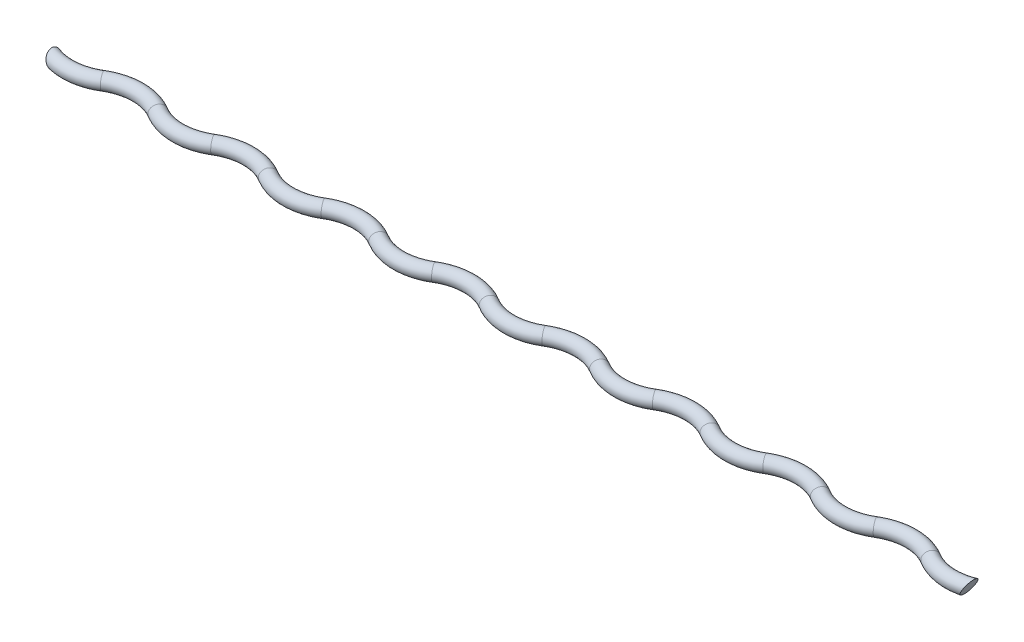
ISO-10303-21;
HEADER;
FILE_DESCRIPTION(('STEP AP214'),'2;1');
FILE_NAME('part.step','',(''),(''),'','','');
FILE_SCHEMA(('AUTOMOTIVE_DESIGN { 1 0 10303 214 1 1 1 1 }'));
ENDSEC;
DATA;
#1=APPLICATION_CONTEXT('core data for automotive mechanical design processes');
#2=APPLICATION_PROTOCOL_DEFINITION('international standard','automotive_design',2000,#1);
#3=PRODUCT_CONTEXT('',#1,'mechanical');
#4=PRODUCT('Part','Part','',(#3));
#5=PRODUCT_RELATED_PRODUCT_CATEGORY('part','',(#4));
#6=PRODUCT_DEFINITION_FORMATION('','',#4);
#7=PRODUCT_DEFINITION_CONTEXT('part definition',#1,'design');
#8=PRODUCT_DEFINITION('design','',#6,#7);
#9=PRODUCT_DEFINITION_SHAPE('','',#8);
#10=(LENGTH_UNIT() NAMED_UNIT(*) SI_UNIT(.MILLI.,.METRE.));
#11=(NAMED_UNIT(*) PLANE_ANGLE_UNIT() SI_UNIT($,.RADIAN.));
#12=(NAMED_UNIT(*) SI_UNIT($,.STERADIAN.) SOLID_ANGLE_UNIT());
#13=UNCERTAINTY_MEASURE_WITH_UNIT(LENGTH_MEASURE(1.E-05),#10,'distance_accuracy_value','');
#14=(GEOMETRIC_REPRESENTATION_CONTEXT(3) GLOBAL_UNCERTAINTY_ASSIGNED_CONTEXT((#13)) GLOBAL_UNIT_ASSIGNED_CONTEXT((#10,
#11,#12)) REPRESENTATION_CONTEXT('',''));
#15=CARTESIAN_POINT('',(0.,0.,0.));
#16=DIRECTION('',(0.,0.,1.));
#17=DIRECTION('',(1.,0.,0.));
#18=AXIS2_PLACEMENT_3D('',#15,#16,#17);
#19=CARTESIAN_POINT('',(0.,0.,29.778888860546));
#20=DIRECTION('',(0.,0.,-1.));
#21=DIRECTION('',(-1.,0.,0.));
#22=AXIS2_PLACEMENT_3D('',#19,#20,#21);
#23=CYLINDRICAL_SURFACE('',#22,6.9);
#24=CARTESIAN_POINT('',(-6.21214177965,-3.003214029924,0.52276900509));
#25=CARTESIAN_POINT('',(-6.214806301209,-2.997702472794,0.521614077615));
#26=CARTESIAN_POINT('',(-6.217469620247,-2.992174686582,0.520919440322));
#27=CARTESIAN_POINT('',(-6.222794401079,-2.981084982956,0.520507682455));
#28=CARTESIAN_POINT('',(-6.225455845464,-2.975523105068,0.520789153658));
#29=CARTESIAN_POINT('',(-6.230376922054,-2.965203360526,0.522357998115));
#30=CARTESIAN_POINT('',(-6.23257925115,-2.960571043337,0.523470663541));
#31=CARTESIAN_POINT('',(-6.236865484463,-2.951530781345,0.526520685088));
#32=CARTESIAN_POINT('',(-6.238949480788,-2.947122628122,0.528457300101));
#33=CARTESIAN_POINT('',(-6.243001091704,-2.938530258931,0.533271685756));
#34=CARTESIAN_POINT('',(-6.244901447442,-2.934488591105,0.536077647221));
#35=CARTESIAN_POINT('',(-6.248442843869,-2.926940280649,0.542464384084));
#36=CARTESIAN_POINT('',(-6.250083977566,-2.923433412759,0.546044842222));
#37=CARTESIAN_POINT('',(-6.252943328206,-2.917312114808,0.5536294715));
#38=CARTESIAN_POINT('',(-6.254145376555,-2.914733593283,0.557444288615));
#39=CARTESIAN_POINT('',(-6.256266107754,-2.910178808916,0.565490413264));
#40=CARTESIAN_POINT('',(-6.257184708337,-2.908202698839,0.569721829185));
#41=CARTESIAN_POINT('',(-6.258746908587,-2.904839169299,0.57863490797));
#42=CARTESIAN_POINT('',(-6.259367991546,-2.903500234468,0.583202586401));
#43=CARTESIAN_POINT('',(-6.260314259316,-2.90145939826,0.592508865184));
#44=CARTESIAN_POINT('',(-6.26063925056,-2.9007578941,0.597247573041));
#45=CARTESIAN_POINT('',(-6.261020023984,-2.899935944931,0.607380319445));
#46=CARTESIAN_POINT('',(-6.261040760891,-2.899891153678,0.61266463536));
#47=CARTESIAN_POINT('',(-6.26075860748,-2.900500262297,0.623185323705));
#48=CARTESIAN_POINT('',(-6.260455449767,-2.901154729552,0.628421657082));
#49=CARTESIAN_POINT('',(-6.259470773364,-2.903278695775,0.639547071304));
#50=CARTESIAN_POINT('',(-6.258756810129,-2.904818006114,0.645289066651));
#51=CARTESIAN_POINT('',(-6.256978109373,-2.908647348134,0.65646099203));
#52=CARTESIAN_POINT('',(-6.255913116017,-2.910937944928,0.661890688455));
#53=CARTESIAN_POINT('',(-6.253283093794,-2.916583853232,0.673070537777));
#54=CARTESIAN_POINT('',(-6.251708480112,-2.919958585547,0.678634486358));
#55=CARTESIAN_POINT('',(-6.24820803645,-2.927441441747,0.689122587212));
#56=CARTESIAN_POINT('',(-6.246282089637,-2.93154986425,0.694046487707));
#57=CARTESIAN_POINT('',(-6.24191243827,-2.940842966824,0.703571050016));
#58=CARTESIAN_POINT('',(-6.239502771281,-2.945953299938,0.707989131137));
#59=CARTESIAN_POINT('',(-6.2343929763,-2.956751578218,0.715841203384));
#60=CARTESIAN_POINT('',(-6.231692931386,-2.962439416921,0.719275395137));
#61=CARTESIAN_POINT('',(-6.225949151198,-2.974491924041,0.725127925085));
#62=CARTESIAN_POINT('',(-6.222988384469,-2.980681920689,0.727446914595));
#63=CARTESIAN_POINT('',(-6.216918806445,-2.993320848092,0.730853823477));
#64=CARTESIAN_POINT('',(-6.213810127243,-2.999769545261,0.731942850788));
#65=CARTESIAN_POINT('',(-6.207591747946,-3.012615638214,0.732744297695));
#66=CARTESIAN_POINT('',(-6.204589555022,-3.018793554907,0.732510224037));
#67=CARTESIAN_POINT('',(-6.198638184986,-3.03099500578,0.730786030203));
#68=CARTESIAN_POINT('',(-6.195688904149,-3.037018731061,0.729297594309));
#69=CARTESIAN_POINT('',(-6.190144730582,-3.048301770653,0.725126741026));
#70=CARTESIAN_POINT('',(-6.187635523566,-3.05339085055,0.722645281186));
#71=CARTESIAN_POINT('',(-6.182857051243,-3.063055295388,0.71666489901));
#72=CARTESIAN_POINT('',(-6.180587496207,-3.067631197213,0.713167071017));
#73=CARTESIAN_POINT('',(-6.176571955687,-3.075707520328,0.705514973242));
#74=CARTESIAN_POINT('',(-6.174860892502,-3.079140278715,0.701608194123));
#75=CARTESIAN_POINT('',(-6.171779279482,-3.085312370427,0.69316454254));
#76=CARTESIAN_POINT('',(-6.170408604708,-3.08805192186,0.688627874758));
#77=CARTESIAN_POINT('',(-6.168138603356,-3.092583389161,0.679305250907));
#78=CARTESIAN_POINT('',(-6.167242703012,-3.094369078575,0.674714220112));
#79=CARTESIAN_POINT('',(-6.165809137538,-3.097224601439,0.665261182124));
#80=CARTESIAN_POINT('',(-6.165271559564,-3.098294243722,0.66039910386));
#81=CARTESIAN_POINT('',(-6.164567269022,-3.099695306223,0.650472378443));
#82=CARTESIAN_POINT('',(-6.164404740412,-3.100018418795,0.645546846013));
#83=CARTESIAN_POINT('',(-6.164424074533,-3.099979972483,0.635698063923));
#84=CARTESIAN_POINT('',(-6.164606137959,-3.099618004185,0.630774815621));
#85=CARTESIAN_POINT('',(-6.165331213529,-3.09817554767,0.620583893966));
#86=CARTESIAN_POINT('',(-6.165889224259,-3.097065169302,0.615444981481));
#87=CARTESIAN_POINT('',(-6.167332905508,-3.094189299537,0.605400309218));
#88=CARTESIAN_POINT('',(-6.168218841598,-3.092423278656,0.600494737987));
#89=CARTESIAN_POINT('',(-6.170448242333,-3.087972719778,0.590237331113));
#90=CARTESIAN_POINT('',(-6.171810723819,-3.085249410659,0.585042834103));
#91=CARTESIAN_POINT('',(-6.174845187444,-3.079171714555,0.575133843327));
#92=CARTESIAN_POINT('',(-6.176517447943,-3.075816790048,0.570419762899));
#93=CARTESIAN_POINT('',(-6.180466358988,-3.067875233167,0.560694632843));
#94=CARTESIAN_POINT('',(-6.182747832074,-3.063275867127,0.55588835039));
#95=CARTESIAN_POINT('',(-6.187586553425,-3.053490205816,0.54707781584));
#96=CARTESIAN_POINT('',(-6.19014393331,-3.048303702812,0.543073866251));
#97=CARTESIAN_POINT('',(-6.195868625989,-3.036652619876,0.535442106954));
#98=CARTESIAN_POINT('',(-6.198991990856,-3.030272617853,0.532026609194));
#99=CARTESIAN_POINT('',(-6.205422915492,-3.017081417709,0.526430263382));
#100=CARTESIAN_POINT('',(-6.208730230567,-3.010270811884,0.524247729011));
#101=CARTESIAN_POINT('',(-6.21214177965,-3.003214029924,0.52276900509));
#102=(BOUNDED_CURVE() B_SPLINE_CURVE(3,(#24,#25,#26,#27,#28,#29,#30,#31,#32,#33,#34,#35,#36,#37,
#38,#39,#40,#41,#42,#43,#44,#45,#46,#47,#48,#49,#50,#51,#52,#53,#54,#55,#56,#57,#58,#59,#60,#61,
#62,#63,#64,#65,#66,#67,#68,#69,#70,#71,#72,#73,#74,#75,#76,#77,#78,#79,#80,#81,#82,#83,#84,#85,
#86,#87,#88,#89,#90,#91,#92,#93,#94,#95,#96,#97,#98,#99,#100,#101),.UNSPECIFIED.,.T.,
.F.) B_SPLINE_CURVE_WITH_KNOTS((4,2,2,2,2,2,2,2,2,2,2,2,2,2,2,2,2,2,2,2,2,2,2,2,2,2,2,2,2,2,2,2,
2,2,2,2,2,2,4),(0.,0.01846299308198,0.03692598616396,0.0526016459599,0.06827730575585,
0.08405916148807,0.09984101722029,0.114043393932,0.128245770644,0.142558980505,0.156872190366,
0.172636516108,0.188400841849,0.206280601333,0.224160360817,0.244179318873,0.264198276929,
0.285670079009,0.307141881089,0.328843648092,0.350545415094,0.371140531979,0.391735648864,
0.410275690955,0.428815733046,0.445173973811,0.461532214575,0.476462831723,0.491393448871,
0.50610554275,0.520817636629,0.536565875412,0.552314114194,0.570261609798,0.588209105401,
0.609201070777,0.630193036152,0.653772944218,0.677352852284),
.UNSPECIFIED.) CURVE() GEOMETRIC_REPRESENTATION_ITEM() RATIONAL_B_SPLINE_CURVE((1.,1.,1.,1.,1.,
1.,1.,1.,1.,1.,1.,1.,1.,1.,1.,1.,1.,1.,1.,1.,1.,1.,1.,1.,1.,1.,1.,1.,1.,1.,1.,1.,1.,1.,1.,1.,1.,
1.,1.,1.,1.,1.,1.,1.,1.,1.,1.,1.,1.,1.,1.,1.,1.,1.,1.,1.,1.,1.,1.,1.,1.,1.,1.,1.,1.,1.,1.,1.,1.,
1.,1.,1.,1.,1.,1.,1.,1.,1.)) REPRESENTATION_ITEM(''));
#103=CARTESIAN_POINT('',(-6.21214177965,-3.003214029924,0.52276900509));
#104=VERTEX_POINT('',#103);
#105=EDGE_CURVE('E166',#104,#104,#102,.T.);
#106=ORIENTED_EDGE('',*,*,#105,.F.);
#107=EDGE_LOOP('',(#106));
#108=FACE_BOUND('',#107,.T.);
#109=ADVANCED_FACE('F17',(#108),#23,.T.);
#110=CARTESIAN_POINT('',(0.,0.,29.778888860546));
#111=DIRECTION('',(0.,0.,-1.));
#112=DIRECTION('',(-1.,0.,0.));
#113=AXIS2_PLACEMENT_3D('',#110,#111,#112);
#114=CYLINDRICAL_SURFACE('',#113,6.9);
#115=CARTESIAN_POINT('',(6.19047847778,-3.047618121771,0.54278516696));
#116=CARTESIAN_POINT('',(6.193670259782,-3.041134810213,0.538099390456));
#117=CARTESIAN_POINT('',(6.196983712414,-3.034378678313,0.534131259149));
#118=CARTESIAN_POINT('',(6.20384250748,-3.020330981484,0.527596161666));
#119=CARTESIAN_POINT('',(6.207387524848,-3.013040220247,0.525027116577));
#120=CARTESIAN_POINT('',(6.213795698559,-2.999797050126,0.521949455508));
#121=CARTESIAN_POINT('',(6.216529484287,-2.994127768345,0.521118562821));
#122=CARTESIAN_POINT('',(6.222002560106,-2.982737679417,0.520477087263));
#123=CARTESIAN_POINT('',(6.224741819913,-2.977016941085,0.520664934168));
#124=CARTESIAN_POINT('',(6.229760844657,-2.966497554546,0.522095404986));
#125=CARTESIAN_POINT('',(6.231981386594,-2.961829415122,0.523138140293));
#126=CARTESIAN_POINT('',(6.236308838911,-2.952706817964,0.526053615071));
#127=CARTESIAN_POINT('',(6.238415839514,-2.948252156162,0.527925588805));
#128=CARTESIAN_POINT('',(6.242519268888,-2.939553786717,0.532618845938));
#129=CARTESIAN_POINT('',(6.244447592516,-2.935454345232,0.53537064725));
#130=CARTESIAN_POINT('',(6.248047608404,-2.927783979691,0.541663743143));
#131=CARTESIAN_POINT('',(6.249719401102,-2.924212814507,0.545204687034));
#132=CARTESIAN_POINT('',(6.252635366622,-2.917972170596,0.552722368533));
#133=CARTESIAN_POINT('',(6.253862648057,-2.915340218979,0.556506626861));
#134=CARTESIAN_POINT('',(6.256033983657,-2.910677826295,0.564503587418));
#135=CARTESIAN_POINT('',(6.256977960871,-2.908647526403,0.568716393054));
#136=CARTESIAN_POINT('',(6.258586874705,-2.905183985304,0.577583036692));
#137=CARTESIAN_POINT('',(6.259229997529,-2.903797724695,0.582121141353));
#138=CARTESIAN_POINT('',(6.26022119936,-2.90166020116,0.591376727931));
#139=CARTESIAN_POINT('',(6.2605690886,-2.900909327003,0.596094320654));
#140=CARTESIAN_POINT('',(6.260998279212,-2.899982902273,0.606179659756));
#141=CARTESIAN_POINT('',(6.261044771831,-2.899882487219,0.611438594515));
#142=CARTESIAN_POINT('',(6.260815337198,-2.900377800919,0.6219176876));
#143=CARTESIAN_POINT('',(6.260539144263,-2.900974092736,0.627137814458));
#144=CARTESIAN_POINT('',(6.259613625143,-2.902970656299,0.638236584816));
#145=CARTESIAN_POINT('',(6.258931404831,-2.90444173838,0.643969901648));
#146=CARTESIAN_POINT('',(6.257216965333,-2.908133420388,0.655136108109));
#147=CARTESIAN_POINT('',(6.256184487514,-2.910354590327,0.660568770416));
#148=CARTESIAN_POINT('',(6.253623100812,-2.9158546595,0.671774365179));
#149=CARTESIAN_POINT('',(6.252083280031,-2.91915588281,0.677362137124));
#150=CARTESIAN_POINT('',(6.248651506547,-2.926494619559,0.687911631723));
#151=CARTESIAN_POINT('',(6.246759429441,-2.930532446575,0.692873096059));
#152=CARTESIAN_POINT('',(6.24245490053,-2.939691190836,0.702501439671));
#153=CARTESIAN_POINT('',(6.240074509101,-2.944741936066,0.70698423395));
#154=CARTESIAN_POINT('',(6.235019362927,-2.955430339745,0.714978313814));
#155=CARTESIAN_POINT('',(6.232344684578,-2.961067905708,0.718489771488));
#156=CARTESIAN_POINT('',(6.226641005387,-2.973043281726,0.724520123847));
#157=CARTESIAN_POINT('',(6.223693300748,-2.979209724708,0.72693480688));
#158=CARTESIAN_POINT('',(6.21764281448,-2.991816624916,0.730539301448));
#159=CARTESIAN_POINT('',(6.21454016867,-2.998256842723,0.731730183757));
#160=CARTESIAN_POINT('',(6.208318783542,-3.011117133049,0.732739562773));
#161=CARTESIAN_POINT('',(6.205307406376,-3.017317769622,0.732604986621));
#162=CARTESIAN_POINT('',(6.199329445942,-3.029580986074,0.731075604088));
#163=CARTESIAN_POINT('',(6.196362770999,-3.035643734721,0.729682480116));
#164=CARTESIAN_POINT('',(6.190772278852,-3.047027198888,0.725685675167));
#165=CARTESIAN_POINT('',(6.188235832262,-3.052174160467,0.723278584193));
#166=CARTESIAN_POINT('',(6.183396873613,-3.061965532938,0.717433522254));
#167=CARTESIAN_POINT('',(6.181094071994,-3.066610480566,0.713996685018));
#168=CARTESIAN_POINT('',(6.177010224205,-3.074827342467,0.706444759953));
#169=CARTESIAN_POINT('',(6.175266014437,-3.078327807203,0.70257770186));
#170=CARTESIAN_POINT('',(6.172116017579,-3.084638763809,0.694197887249));
#171=CARTESIAN_POINT('',(6.170710095807,-3.087449492576,0.689685359362));
#172=CARTESIAN_POINT('',(6.168373918114,-3.092114064586,0.680402003953));
#173=CARTESIAN_POINT('',(6.167447619067,-3.093960671902,0.67582883721));
#174=CARTESIAN_POINT('',(6.165953466639,-3.096937296823,0.666399134516));
#175=CARTESIAN_POINT('',(6.165385694151,-3.098067135354,0.661542529129));
#176=CARTESIAN_POINT('',(6.164623692091,-3.099583107716,0.65163015658));
#177=CARTESIAN_POINT('',(6.164433273098,-3.099961680912,0.646714898079));
#178=CARTESIAN_POINT('',(6.164397500711,-3.100032815121,0.636877119375));
#179=CARTESIAN_POINT('',(6.164552344743,-3.099724972941,0.631954594926));
#180=CARTESIAN_POINT('',(6.165221205585,-3.098394435395,0.621771242945));
#181=CARTESIAN_POINT('',(6.165749849986,-3.097342598337,0.616638743169));
#182=CARTESIAN_POINT('',(6.167135439029,-3.094582824995,0.606597890792));
#183=CARTESIAN_POINT('',(6.167992647353,-3.092874362521,0.601689718009));
#184=CARTESIAN_POINT('',(6.170159237691,-3.088550081601,0.591427915185));
#185=CARTESIAN_POINT('',(6.171487738956,-3.085895350602,0.586229975135));
#186=CARTESIAN_POINT('',(6.174455103986,-3.079953765208,0.576303390427));
#187=CARTESIAN_POINT('',(6.176094247537,-3.076666369486,0.571575151825));
#188=CARTESIAN_POINT('',(6.179744322349,-3.069328526683,0.562380860666));
#189=CARTESIAN_POINT('',(6.181731816564,-3.065324482783,0.558024798938));
#190=CARTESIAN_POINT('',(6.185934575934,-3.056834287124,0.549936086522));
#191=CARTESIAN_POINT('',(6.188149933352,-3.052347980824,0.546203645652));
#192=CARTESIAN_POINT('',(6.19047847778,-3.047618121771,0.54278516696));
#193=(BOUNDED_CURVE() B_SPLINE_CURVE(3,(#115,#116,#117,#118,#119,#120,#121,#122,#123,#124,#125,
#126,#127,#128,#129,#130,#131,#132,#133,#134,#135,#136,#137,#138,#139,#140,#141,#142,#143,#144,
#145,#146,#147,#148,#149,#150,#151,#152,#153,#154,#155,#156,#157,#158,#159,#160,#161,#162,#163,
#164,#165,#166,#167,#168,#169,#170,#171,#172,#173,#174,#175,#176,#177,#178,#179,#180,#181,#182,
#183,#184,#185,#186,#187,#188,#189,#190,#191,#192),.UNSPECIFIED.,.T.,
.F.) B_SPLINE_CURVE_WITH_KNOTS((4,2,2,2,2,2,2,2,2,2,2,2,2,2,2,2,2,2,2,2,2,2,2,2,2,2,2,2,2,2,2,2,
2,2,2,2,2,2,4),(0.,0.02541548435956,0.05083096871912,0.06971239709316,0.08859382546719,
0.104253881045,0.119913936623,0.135684228871,0.151454521119,0.165609771,0.179765020881,
0.193961137972,0.208157255063,0.223757872063,0.239358489064,0.257047712758,0.274736936452,
0.294565518859,0.314394101267,0.335706188417,0.357018275566,0.378612118137,0.400205960708,
0.420747734898,0.441289509087,0.45981182712,0.478334145153,0.494674139355,0.511014133556,
0.525893179903,0.54077222625,0.555384278363,0.569996330475,0.585590797024,0.601185263574,
0.618924016511,0.636662769447,0.655151632347,0.673640495246),
.UNSPECIFIED.) CURVE() GEOMETRIC_REPRESENTATION_ITEM() RATIONAL_B_SPLINE_CURVE((1.,1.,1.,1.,1.,
1.,1.,1.,1.,1.,1.,1.,1.,1.,1.,1.,1.,1.,1.,1.,1.,1.,1.,1.,1.,1.,1.,1.,1.,1.,1.,1.,1.,1.,1.,1.,1.,
1.,1.,1.,1.,1.,1.,1.,1.,1.,1.,1.,1.,1.,1.,1.,1.,1.,1.,1.,1.,1.,1.,1.,1.,1.,1.,1.,1.,1.,1.,1.,1.,
1.,1.,1.,1.,1.,1.,1.,1.,1.)) REPRESENTATION_ITEM(''));
#194=CARTESIAN_POINT('',(6.19047847778,-3.047618121771,0.54278516696));
#195=VERTEX_POINT('',#194);
#196=EDGE_CURVE('E28',#195,#195,#193,.T.);
#197=ORIENTED_EDGE('',*,*,#196,.T.);
#198=EDGE_LOOP('',(#197));
#199=FACE_BOUND('',#198,.T.);
#200=ADVANCED_FACE('F19',(#199),#114,.T.);
#201=CARTESIAN_POINT('',(6.,-3.,-0.06214285714286));
#202=DIRECTION('',(0.,-1.,0.));
#203=DIRECTION('',(0.,0.,1.));
#204=AXIS2_PLACEMENT_3D('',#201,#202,#203);
#205=TOROIDAL_SURFACE('',#204,0.722142857143,0.1);
#206=ORIENTED_EDGE('',*,*,#196,.F.);
#207=CARTESIAN_POINT('',(6.19047847778,-3.047618121771,0.54278516696));
#208=CARTESIAN_POINT('',(6.087511601893,-3.047618121771,0.575207162634));
#209=CARTESIAN_POINT('',(5.977645882082,-3.047618121771,0.585728750439));
#210=CARTESIAN_POINT('',(5.867098599505,-3.047618121771,0.572344766255));
#211=CARTESIAN_POINT('',(5.762918071344,-3.047618121771,0.535908551417));
#212=CARTESIAN_POINT('',(5.670663428783,-3.047618121771,0.479851042916));
#213=(BOUNDED_CURVE() B_SPLINE_CURVE(5,(#207,#208,#209,#210,#211,#212),.UNSPECIFIED.,.F.,
.F.) B_SPLINE_CURVE_WITH_KNOTS((6,6),(5.978135546814,6.829202713353),
.UNSPECIFIED.) CURVE() GEOMETRIC_REPRESENTATION_ITEM() RATIONAL_B_SPLINE_CURVE((1.,1.,1.,1.,1.,1.)) REPRESENTATION_ITEM(''));
#214=CARTESIAN_POINT('',(5.670663428783,-3.047618121771,0.479851042916));
#215=VERTEX_POINT('',#214);
#216=EDGE_CURVE('E11',#195,#215,#213,.T.);
#217=ORIENTED_EDGE('',*,*,#216,.T.);
#218=CARTESIAN_POINT('',(5.625,-3.,0.555));
#219=DIRECTION('',(-0.854599406528091,0.,-0.519287833828056));
#220=DIRECTION('',(0.519287833828056,0.,-0.854599406528091));
#221=AXIS2_PLACEMENT_3D('',#218,#219,#220);
#222=CIRCLE('',#221,0.1);
#223=CARTESIAN_POINT('',(5.676928783383,-3.,0.469540059347));
#224=VERTEX_POINT('',#223);
#225=EDGE_CURVE('E155',#224,#215,#222,.T.);
#226=ORIENTED_EDGE('',*,*,#225,.F.);
#227=CARTESIAN_POINT('',(5.625,-3.,0.555));
#228=DIRECTION('',(-0.854599406528091,0.,-0.519287833828056));
#229=DIRECTION('',(0.519287833828056,0.,-0.854599406528091));
#230=AXIS2_PLACEMENT_3D('',#227,#228,#229);
#231=CIRCLE('',#230,0.1);
#232=EDGE_CURVE('E162',#215,#224,#231,.T.);
#233=ORIENTED_EDGE('',*,*,#232,.F.);
#234=ORIENTED_EDGE('',*,*,#216,.F.);
#235=EDGE_LOOP('',(#206,#217,#226,#233,#234));
#236=FACE_BOUND('',#235,.T.);
#237=ADVANCED_FACE('F462',(#236),#205,.T.);
#238=CARTESIAN_POINT('',(5.25,-3.,1.172142857143));
#239=DIRECTION('',(0.,1.,0.));
#240=DIRECTION('',(0.,0.,-1.));
#241=AXIS2_PLACEMENT_3D('',#238,#239,#240);
#242=TOROIDAL_SURFACE('',#241,0.722142857143,0.1);
#243=CARTESIAN_POINT('',(4.875,-3.,0.555));
#244=DIRECTION('',(-0.854599406528091,0.,0.519287833828056));
#245=DIRECTION('',(-0.519287833828056,0.,-0.854599406528091));
#246=AXIS2_PLACEMENT_3D('',#243,#244,#245);
#247=CIRCLE('',#246,0.1);
#248=CARTESIAN_POINT('',(4.823071216617,-3.,0.469540059347));
#249=VERTEX_POINT('',#248);
#250=EDGE_CURVE('E173',#249,#249,#247,.T.);
#251=ORIENTED_EDGE('',*,*,#250,.F.);
#252=CARTESIAN_POINT('',(5.676928783383,-3.,0.469540059347));
#253=CARTESIAN_POINT('',(5.523475440494,-3.,0.376295840578));
#254=CARTESIAN_POINT('',(5.344568481044,-3.,0.32490242308));
#255=CARTESIAN_POINT('',(5.155431518956,-3.,0.32490242308));
#256=CARTESIAN_POINT('',(4.976524559506,-3.,0.376295840578));
#257=CARTESIAN_POINT('',(4.823071216617,-3.,0.469540059347));
#258=(BOUNDED_CURVE() B_SPLINE_CURVE(5,(#252,#253,#254,#255,#256,#257),.UNSPECIFIED.,.F.,
.F.) B_SPLINE_CURVE_WITH_KNOTS((6,6),(-0.546017406173,0.546017406173),
.UNSPECIFIED.) CURVE() GEOMETRIC_REPRESENTATION_ITEM() RATIONAL_B_SPLINE_CURVE((1.,1.,1.,1.,1.,1.)) REPRESENTATION_ITEM(''));
#259=EDGE_CURVE('E163',#224,#249,#258,.T.);
#260=ORIENTED_EDGE('',*,*,#259,.F.);
#261=ORIENTED_EDGE('',*,*,#225,.T.);
#262=ORIENTED_EDGE('',*,*,#232,.T.);
#263=ORIENTED_EDGE('',*,*,#259,.T.);
#264=EDGE_LOOP('',(#251,#260,#261,#262,#263));
#265=FACE_BOUND('',#264,.T.);
#266=ADVANCED_FACE('F483',(#265),#242,.T.);
#267=CARTESIAN_POINT('',(4.5,-3.,-0.06214285714286));
#268=DIRECTION('',(0.,-1.,0.));
#269=DIRECTION('',(0.,0.,1.));
#270=AXIS2_PLACEMENT_3D('',#267,#268,#269);
#271=TOROIDAL_SURFACE('',#270,0.722142857143,0.1);
#272=CARTESIAN_POINT('',(4.125,-3.,0.555));
#273=DIRECTION('',(-0.854599406528091,0.,-0.519287833828056));
#274=DIRECTION('',(0.519287833828056,0.,-0.854599406528091));
#275=AXIS2_PLACEMENT_3D('',#272,#273,#274);
#276=CIRCLE('',#275,0.1);
#277=CARTESIAN_POINT('',(4.176928783383,-3.,0.469540059347));
#278=VERTEX_POINT('',#277);
#279=EDGE_CURVE('E243',#278,#278,#276,.T.);
#280=ORIENTED_EDGE('',*,*,#279,.F.);
#281=CARTESIAN_POINT('',(4.823071216617,-3.,0.469540059347));
#282=CARTESIAN_POINT('',(4.70694796583,-3.,0.54010106243));
#283=CARTESIAN_POINT('',(4.571563116411,-3.,0.578992171588));
#284=CARTESIAN_POINT('',(4.428436883589,-3.,0.578992171588));
#285=CARTESIAN_POINT('',(4.29305203417,-3.,0.54010106243));
#286=CARTESIAN_POINT('',(4.176928783383,-3.,0.469540059347));
#287=(BOUNDED_CURVE() B_SPLINE_CURVE(5,(#281,#282,#283,#284,#285,#286),.UNSPECIFIED.,.F.,
.F.) B_SPLINE_CURVE_WITH_KNOTS((6,6),(-0.546017406173,0.546017406173),
.UNSPECIFIED.) CURVE() GEOMETRIC_REPRESENTATION_ITEM() RATIONAL_B_SPLINE_CURVE((1.,1.,1.,1.,1.,1.)) REPRESENTATION_ITEM(''));
#288=EDGE_CURVE('E180',#249,#278,#287,.T.);
#289=ORIENTED_EDGE('',*,*,#288,.F.);
#290=ORIENTED_EDGE('',*,*,#250,.T.);
#291=ORIENTED_EDGE('',*,*,#288,.T.);
#292=EDGE_LOOP('',(#280,#289,#290,#291));
#293=FACE_BOUND('',#292,.T.);
#294=ADVANCED_FACE('F465',(#293),#271,.T.);
#295=CARTESIAN_POINT('',(3.75,-3.,1.172142857143));
#296=DIRECTION('',(0.,1.,0.));
#297=DIRECTION('',(0.,0.,-1.));
#298=AXIS2_PLACEMENT_3D('',#295,#296,#297);
#299=TOROIDAL_SURFACE('',#298,0.722142857143,0.1);
#300=CARTESIAN_POINT('',(3.375,-3.,0.555));
#301=DIRECTION('',(-0.854599406528091,0.,0.519287833828056));
#302=DIRECTION('',(-0.519287833828056,0.,-0.854599406528091));
#303=AXIS2_PLACEMENT_3D('',#300,#301,#302);
#304=CIRCLE('',#303,0.1);
#305=CARTESIAN_POINT('',(3.323071216617,-3.,0.469540059347));
#306=VERTEX_POINT('',#305);
#307=EDGE_CURVE('E212',#306,#306,#304,.T.);
#308=ORIENTED_EDGE('',*,*,#307,.F.);
#309=CARTESIAN_POINT('',(4.176928783383,-3.,0.469540059347));
#310=CARTESIAN_POINT('',(4.023475440494,-3.,0.376295840578));
#311=CARTESIAN_POINT('',(3.844568481044,-3.,0.32490242308));
#312=CARTESIAN_POINT('',(3.655431518956,-3.,0.32490242308));
#313=CARTESIAN_POINT('',(3.476524559506,-3.,0.376295840578));
#314=CARTESIAN_POINT('',(3.323071216617,-3.,0.469540059347));
#315=(BOUNDED_CURVE() B_SPLINE_CURVE(5,(#309,#310,#311,#312,#313,#314),.UNSPECIFIED.,.F.,
.F.) B_SPLINE_CURVE_WITH_KNOTS((6,6),(-0.546017406173,0.546017406173),
.UNSPECIFIED.) CURVE() GEOMETRIC_REPRESENTATION_ITEM() RATIONAL_B_SPLINE_CURVE((1.,1.,1.,1.,1.,1.)) REPRESENTATION_ITEM(''));
#316=EDGE_CURVE('E215',#278,#306,#315,.T.);
#317=ORIENTED_EDGE('',*,*,#316,.F.);
#318=ORIENTED_EDGE('',*,*,#279,.T.);
#319=ORIENTED_EDGE('',*,*,#316,.T.);
#320=EDGE_LOOP('',(#308,#317,#318,#319));
#321=FACE_BOUND('',#320,.T.);
#322=ADVANCED_FACE('F478',(#321),#299,.T.);
#323=CARTESIAN_POINT('',(3.,-3.,-0.06214285714286));
#324=DIRECTION('',(0.,-1.,0.));
#325=DIRECTION('',(0.,0.,1.));
#326=AXIS2_PLACEMENT_3D('',#323,#324,#325);
#327=TOROIDAL_SURFACE('',#326,0.722142857143,0.1);
#328=CARTESIAN_POINT('',(2.625,-3.,0.555));
#329=DIRECTION('',(-0.854599406528091,0.,-0.519287833828056));
#330=DIRECTION('',(0.519287833828056,0.,-0.854599406528091));
#331=AXIS2_PLACEMENT_3D('',#328,#329,#330);
#332=CIRCLE('',#331,0.1);
#333=CARTESIAN_POINT('',(2.676928783383,-3.,0.469540059347));
#334=VERTEX_POINT('',#333);
#335=EDGE_CURVE('E220',#334,#334,#332,.T.);
#336=ORIENTED_EDGE('',*,*,#335,.F.);
#337=CARTESIAN_POINT('',(3.323071216617,-3.,0.469540059347));
#338=CARTESIAN_POINT('',(3.20694796583,-3.,0.54010106243));
#339=CARTESIAN_POINT('',(3.071563116411,-3.,0.578992171588));
#340=CARTESIAN_POINT('',(2.928436883589,-3.,0.578992171588));
#341=CARTESIAN_POINT('',(2.79305203417,-3.,0.54010106243));
#342=CARTESIAN_POINT('',(2.676928783383,-3.,0.469540059347));
#343=(BOUNDED_CURVE() B_SPLINE_CURVE(5,(#337,#338,#339,#340,#341,#342),.UNSPECIFIED.,.F.,
.F.) B_SPLINE_CURVE_WITH_KNOTS((6,6),(-0.546017406173,0.546017406173),
.UNSPECIFIED.) CURVE() GEOMETRIC_REPRESENTATION_ITEM() RATIONAL_B_SPLINE_CURVE((1.,1.,1.,1.,1.,1.)) REPRESENTATION_ITEM(''));
#344=EDGE_CURVE('E216',#306,#334,#343,.T.);
#345=ORIENTED_EDGE('',*,*,#344,.F.);
#346=ORIENTED_EDGE('',*,*,#307,.T.);
#347=ORIENTED_EDGE('',*,*,#344,.T.);
#348=EDGE_LOOP('',(#336,#345,#346,#347));
#349=FACE_BOUND('',#348,.T.);
#350=ADVANCED_FACE('F481',(#349),#327,.T.);
#351=CARTESIAN_POINT('',(2.25,-3.,1.172142857143));
#352=DIRECTION('',(0.,1.,0.));
#353=DIRECTION('',(0.,0.,-1.));
#354=AXIS2_PLACEMENT_3D('',#351,#352,#353);
#355=TOROIDAL_SURFACE('',#354,0.722142857143,0.1);
#356=CARTESIAN_POINT('',(1.875,-3.,0.555));
#357=DIRECTION('',(-0.854599406528091,0.,0.519287833828056));
#358=DIRECTION('',(-0.519287833828056,0.,-0.854599406528091));
#359=AXIS2_PLACEMENT_3D('',#356,#357,#358);
#360=CIRCLE('',#359,0.1);
#361=CARTESIAN_POINT('',(1.823071216617,-3.,0.469540059347));
#362=VERTEX_POINT('',#361);
#363=EDGE_CURVE('E191',#362,#362,#360,.T.);
#364=ORIENTED_EDGE('',*,*,#363,.F.);
#365=CARTESIAN_POINT('',(2.676928783383,-3.,0.469540059347));
#366=CARTESIAN_POINT('',(2.523475440494,-3.,0.376295840578));
#367=CARTESIAN_POINT('',(2.344568481044,-3.,0.32490242308));
#368=CARTESIAN_POINT('',(2.155431518956,-3.,0.32490242308));
#369=CARTESIAN_POINT('',(1.976524559506,-3.,0.376295840578));
#370=CARTESIAN_POINT('',(1.823071216617,-3.,0.469540059347));
#371=(BOUNDED_CURVE() B_SPLINE_CURVE(5,(#365,#366,#367,#368,#369,#370),.UNSPECIFIED.,.F.,
.F.) B_SPLINE_CURVE_WITH_KNOTS((6,6),(-0.546017406173,0.546017406173),
.UNSPECIFIED.) CURVE() GEOMETRIC_REPRESENTATION_ITEM() RATIONAL_B_SPLINE_CURVE((1.,1.,1.,1.,1.,1.)) REPRESENTATION_ITEM(''));
#372=EDGE_CURVE('E190',#334,#362,#371,.T.);
#373=ORIENTED_EDGE('',*,*,#372,.F.);
#374=ORIENTED_EDGE('',*,*,#335,.T.);
#375=ORIENTED_EDGE('',*,*,#372,.T.);
#376=EDGE_LOOP('',(#364,#373,#374,#375));
#377=FACE_BOUND('',#376,.T.);
#378=ADVANCED_FACE('F477',(#377),#355,.T.);
#379=CARTESIAN_POINT('',(1.5,-3.,-0.06214285714286));
#380=DIRECTION('',(0.,1.,0.));
#381=DIRECTION('',(0.,0.,-1.));
#382=AXIS2_PLACEMENT_3D('',#379,#380,#381);
#383=TOROIDAL_SURFACE('',#382,0.722142857143,0.1);
#384=ORIENTED_EDGE('',*,*,#363,.T.);
#385=CARTESIAN_POINT('',(1.176928783383,-3.,0.469540059347));
#386=CARTESIAN_POINT('',(1.29305203417,-3.,0.54010106243));
#387=CARTESIAN_POINT('',(1.428436883589,-3.,0.578992171588));
#388=CARTESIAN_POINT('',(1.571563116411,-3.,0.578992171588));
#389=CARTESIAN_POINT('',(1.70694796583,-3.,0.54010106243));
#390=CARTESIAN_POINT('',(1.823071216617,-3.,0.469540059347));
#391=(BOUNDED_CURVE() B_SPLINE_CURVE(5,(#385,#386,#387,#388,#389,#390),.UNSPECIFIED.,.F.,
.F.) B_SPLINE_CURVE_WITH_KNOTS((6,6),(2.595575247416,3.687610059763),
.UNSPECIFIED.) CURVE() GEOMETRIC_REPRESENTATION_ITEM() RATIONAL_B_SPLINE_CURVE((1.,1.,1.,1.,1.,1.)) REPRESENTATION_ITEM(''));
#392=CARTESIAN_POINT('',(1.176928783383,-3.,0.469540059347));
#393=VERTEX_POINT('',#392);
#394=EDGE_CURVE('E184',#393,#362,#391,.T.);
#395=ORIENTED_EDGE('',*,*,#394,.F.);
#396=CARTESIAN_POINT('',(1.125,-3.,0.555));
#397=DIRECTION('',(-0.854599406528091,0.,-0.519287833828056));
#398=DIRECTION('',(0.519287833828056,0.,-0.854599406528091));
#399=AXIS2_PLACEMENT_3D('',#396,#397,#398);
#400=CIRCLE('',#399,0.1);
#401=EDGE_CURVE('E133',#393,#393,#400,.T.);
#402=ORIENTED_EDGE('',*,*,#401,.F.);
#403=ORIENTED_EDGE('',*,*,#394,.T.);
#404=EDGE_LOOP('',(#384,#395,#402,#403));
#405=FACE_BOUND('',#404,.T.);
#406=ADVANCED_FACE('F363',(#405),#383,.T.);
#407=CARTESIAN_POINT('',(0.75,-3.,1.172142857143));
#408=DIRECTION('',(0.,1.,0.));
#409=DIRECTION('',(0.,0.,-1.));
#410=AXIS2_PLACEMENT_3D('',#407,#408,#409);
#411=TOROIDAL_SURFACE('',#410,0.722142857143,0.1);
#412=CARTESIAN_POINT('',(0.375,-3.,0.555));
#413=DIRECTION('',(-0.854599406528091,0.,0.519287833828056));
#414=DIRECTION('',(-0.519287833828056,0.,-0.854599406528091));
#415=AXIS2_PLACEMENT_3D('',#412,#413,#414);
#416=CIRCLE('',#415,0.1);
#417=CARTESIAN_POINT('',(0.323071216617,-3.,0.469540059347));
#418=VERTEX_POINT('',#417);
#419=EDGE_CURVE('E172',#418,#418,#416,.T.);
#420=ORIENTED_EDGE('',*,*,#419,.F.);
#421=CARTESIAN_POINT('',(1.176928783383,-3.,0.469540059347));
#422=CARTESIAN_POINT('',(1.023475440494,-3.,0.376295840578));
#423=CARTESIAN_POINT('',(0.844568481044,-3.,0.32490242308));
#424=CARTESIAN_POINT('',(0.655431518956,-3.,0.32490242308));
#425=CARTESIAN_POINT('',(0.476524559506,-3.,0.376295840578));
#426=CARTESIAN_POINT('',(0.323071216617,-3.,0.469540059347));
#427=(BOUNDED_CURVE() B_SPLINE_CURVE(5,(#421,#422,#423,#424,#425,#426),.UNSPECIFIED.,.F.,
.F.) B_SPLINE_CURVE_WITH_KNOTS((6,6),(-0.546017406173,0.546017406173),
.UNSPECIFIED.) CURVE() GEOMETRIC_REPRESENTATION_ITEM() RATIONAL_B_SPLINE_CURVE((1.,1.,1.,1.,1.,1.)) REPRESENTATION_ITEM(''));
#428=EDGE_CURVE('E167',#393,#418,#427,.T.);
#429=ORIENTED_EDGE('',*,*,#428,.F.);
#430=ORIENTED_EDGE('',*,*,#401,.T.);
#431=ORIENTED_EDGE('',*,*,#428,.T.);
#432=EDGE_LOOP('',(#420,#429,#430,#431));
#433=FACE_BOUND('',#432,.T.);
#434=ADVANCED_FACE('F361',(#433),#411,.T.);
#435=CARTESIAN_POINT('',(0.,-3.,-0.06214285714286));
#436=DIRECTION('',(0.,-1.,0.));
#437=DIRECTION('',(0.,0.,1.));
#438=AXIS2_PLACEMENT_3D('',#435,#436,#437);
#439=TOROIDAL_SURFACE('',#438,0.722142857143,0.1);
#440=CARTESIAN_POINT('',(-0.375,-3.,0.555));
#441=DIRECTION('',(-0.854599406528091,0.,-0.519287833828056));
#442=DIRECTION('',(0.519287833828056,0.,-0.854599406528091));
#443=AXIS2_PLACEMENT_3D('',#440,#441,#442);
#444=CIRCLE('',#443,0.1);
#445=CARTESIAN_POINT('',(-0.323071216617,-3.,0.469540059347));
#446=VERTEX_POINT('',#445);
#447=EDGE_CURVE('E113',#446,#446,#444,.T.);
#448=ORIENTED_EDGE('',*,*,#447,.F.);
#449=CARTESIAN_POINT('',(0.323071216617,-3.,0.469540059347));
#450=CARTESIAN_POINT('',(0.20694796583,-3.,0.54010106243));
#451=CARTESIAN_POINT('',(0.07156311641088,-3.,0.578992171588));
#452=CARTESIAN_POINT('',(-0.07156311641088,-3.,0.578992171588));
#453=CARTESIAN_POINT('',(-0.20694796583,-3.,0.54010106243));
#454=CARTESIAN_POINT('',(-0.323071216617,-3.,0.469540059347));
#455=(BOUNDED_CURVE() B_SPLINE_CURVE(5,(#449,#450,#451,#452,#453,#454),.UNSPECIFIED.,.F.,
.F.) B_SPLINE_CURVE_WITH_KNOTS((6,6),(-0.546017406173,0.546017406173),
.UNSPECIFIED.) CURVE() GEOMETRIC_REPRESENTATION_ITEM() RATIONAL_B_SPLINE_CURVE((1.,1.,1.,1.,1.,1.)) REPRESENTATION_ITEM(''));
#456=EDGE_CURVE('E192',#418,#446,#455,.T.);
#457=ORIENTED_EDGE('',*,*,#456,.F.);
#458=ORIENTED_EDGE('',*,*,#419,.T.);
#459=ORIENTED_EDGE('',*,*,#456,.T.);
#460=EDGE_LOOP('',(#448,#457,#458,#459));
#461=FACE_BOUND('',#460,.T.);
#462=ADVANCED_FACE('F489',(#461),#439,.T.);
#463=CARTESIAN_POINT('',(-6.,-3.,-0.06214285714286));
#464=DIRECTION('',(0.,1.,0.));
#465=DIRECTION('',(0.,0.,-1.));
#466=AXIS2_PLACEMENT_3D('',#463,#464,#465);
#467=TOROIDAL_SURFACE('',#466,0.722142857143,0.1);
#468=ORIENTED_EDGE('',*,*,#105,.T.);
#469=CARTESIAN_POINT('',(-6.21214177965,-3.003214029924,0.52276900509));
#470=CARTESIAN_POINT('',(-6.107565099794,-3.003214029924,0.56069793833));
#471=CARTESIAN_POINT('',(-5.994511307981,-3.003214029924,0.575265145108));
#472=CARTESIAN_POINT('',(-5.879946135728,-3.003214029924,0.563881229252));
#473=CARTESIAN_POINT('',(-5.771969699556,-3.003214029924,0.527351069271));
#474=CARTESIAN_POINT('',(-5.676901955266,-3.003214029924,0.469584210762));
#475=(BOUNDED_CURVE() B_SPLINE_CURVE(5,(#469,#470,#471,#472,#473,#474),.UNSPECIFIED.,.F.,
.F.) B_SPLINE_CURVE_WITH_KNOTS((6,6),(2.793657597795,3.687610059763),
.UNSPECIFIED.) CURVE() GEOMETRIC_REPRESENTATION_ITEM() RATIONAL_B_SPLINE_CURVE((1.,1.,1.,1.,1.,1.)) REPRESENTATION_ITEM(''));
#476=CARTESIAN_POINT('',(-5.676901955266,-3.003214029924,0.469584210762));
#477=VERTEX_POINT('',#476);
#478=EDGE_CURVE('E71',#104,#477,#475,.T.);
#479=ORIENTED_EDGE('',*,*,#478,.T.);
#480=CARTESIAN_POINT('',(-5.625,-3.,0.555));
#481=DIRECTION('',(-0.854599406528091,0.,0.519287833828056));
#482=DIRECTION('',(-0.519287833828056,0.,-0.854599406528091));
#483=AXIS2_PLACEMENT_3D('',#480,#481,#482);
#484=CIRCLE('',#483,0.1);
#485=CARTESIAN_POINT('',(-5.676928783383,-3.,0.469540059347));
#486=VERTEX_POINT('',#485);
#487=EDGE_CURVE('E80',#477,#486,#484,.T.);
#488=ORIENTED_EDGE('',*,*,#487,.T.);
#489=CARTESIAN_POINT('',(-5.625,-3.,0.555));
#490=DIRECTION('',(-0.854599406528091,0.,0.519287833828056));
#491=DIRECTION('',(-0.519287833828056,0.,-0.854599406528091));
#492=AXIS2_PLACEMENT_3D('',#489,#490,#491);
#493=CIRCLE('',#492,0.1);
#494=EDGE_CURVE('E143',#486,#477,#493,.T.);
#495=ORIENTED_EDGE('',*,*,#494,.T.);
#496=ORIENTED_EDGE('',*,*,#478,.F.);
#497=EDGE_LOOP('',(#468,#479,#488,#495,#496));
#498=FACE_BOUND('',#497,.T.);
#499=ADVANCED_FACE('F302',(#498),#467,.T.);
#500=CARTESIAN_POINT('',(-5.25,-3.,1.172142857143));
#501=DIRECTION('',(0.,1.,0.));
#502=DIRECTION('',(0.,0.,-1.));
#503=AXIS2_PLACEMENT_3D('',#500,#501,#502);
#504=TOROIDAL_SURFACE('',#503,0.722142857143,0.1);
#505=ORIENTED_EDGE('',*,*,#494,.F.);
#506=CARTESIAN_POINT('',(-4.823071216617,-3.,0.469540059347));
#507=CARTESIAN_POINT('',(-4.976524559506,-3.,0.376295840578));
#508=CARTESIAN_POINT('',(-5.155431518956,-3.,0.32490242308));
#509=CARTESIAN_POINT('',(-5.344568481044,-3.,0.32490242308));
#510=CARTESIAN_POINT('',(-5.523475440494,-3.,0.376295840578));
#511=CARTESIAN_POINT('',(-5.676928783383,-3.,0.469540059347));
#512=(BOUNDED_CURVE() B_SPLINE_CURVE(5,(#506,#507,#508,#509,#510,#511),.UNSPECIFIED.,.F.,
.F.) B_SPLINE_CURVE_WITH_KNOTS((6,6),(-0.546017406173,0.546017406173),
.UNSPECIFIED.) CURVE() GEOMETRIC_REPRESENTATION_ITEM() RATIONAL_B_SPLINE_CURVE((1.,1.,1.,1.,1.,1.)) REPRESENTATION_ITEM(''));
#513=CARTESIAN_POINT('',(-4.823071216617,-3.,0.469540059347));
#514=VERTEX_POINT('',#513);
#515=EDGE_CURVE('E135',#514,#486,#512,.T.);
#516=ORIENTED_EDGE('',*,*,#515,.F.);
#517=CARTESIAN_POINT('',(-4.875,-3.,0.555));
#518=DIRECTION('',(-0.854599406528091,0.,-0.519287833828056));
#519=DIRECTION('',(0.519287833828056,0.,-0.854599406528091));
#520=AXIS2_PLACEMENT_3D('',#517,#518,#519);
#521=CIRCLE('',#520,0.1);
#522=EDGE_CURVE('E227',#514,#514,#521,.T.);
#523=ORIENTED_EDGE('',*,*,#522,.T.);
#524=ORIENTED_EDGE('',*,*,#515,.T.);
#525=ORIENTED_EDGE('',*,*,#487,.F.);
#526=EDGE_LOOP('',(#505,#516,#523,#524,#525));
#527=FACE_BOUND('',#526,.T.);
#528=ADVANCED_FACE('F304',(#527),#504,.T.);
#529=CARTESIAN_POINT('',(-4.5,-3.,-0.06214285714286));
#530=DIRECTION('',(0.,1.,0.));
#531=DIRECTION('',(0.,0.,-1.));
#532=AXIS2_PLACEMENT_3D('',#529,#530,#531);
#533=TOROIDAL_SURFACE('',#532,0.722142857143,0.1);
#534=CARTESIAN_POINT('',(-4.125,-3.,0.555));
#535=DIRECTION('',(-0.854599406528091,0.,0.519287833828056));
#536=DIRECTION('',(-0.519287833828056,0.,-0.854599406528091));
#537=AXIS2_PLACEMENT_3D('',#534,#535,#536);
#538=CIRCLE('',#537,0.1);
#539=CARTESIAN_POINT('',(-4.176928783383,-3.,0.469540059347));
#540=VERTEX_POINT('',#539);
#541=EDGE_CURVE('E200',#540,#540,#538,.T.);
#542=ORIENTED_EDGE('',*,*,#541,.T.);
#543=CARTESIAN_POINT('',(-4.823071216617,-3.,0.469540059347));
#544=CARTESIAN_POINT('',(-4.70694796583,-3.,0.54010106243));
#545=CARTESIAN_POINT('',(-4.571563116411,-3.,0.578992171588));
#546=CARTESIAN_POINT('',(-4.428436883589,-3.,0.578992171588));
#547=CARTESIAN_POINT('',(-4.29305203417,-3.,0.54010106243));
#548=CARTESIAN_POINT('',(-4.176928783383,-3.,0.469540059347));
#549=(BOUNDED_CURVE() B_SPLINE_CURVE(5,(#543,#544,#545,#546,#547,#548),.UNSPECIFIED.,.F.,
.F.) B_SPLINE_CURVE_WITH_KNOTS((6,6),(2.595575247416,3.687610059763),
.UNSPECIFIED.) CURVE() GEOMETRIC_REPRESENTATION_ITEM() RATIONAL_B_SPLINE_CURVE((1.,1.,1.,1.,1.,1.)) REPRESENTATION_ITEM(''));
#550=EDGE_CURVE('E231',#514,#540,#549,.T.);
#551=ORIENTED_EDGE('',*,*,#550,.F.);
#552=ORIENTED_EDGE('',*,*,#522,.F.);
#553=ORIENTED_EDGE('',*,*,#550,.T.);
#554=EDGE_LOOP('',(#542,#551,#552,#553));
#555=FACE_BOUND('',#554,.T.);
#556=ADVANCED_FACE('F308',(#555),#533,.T.);
#557=CARTESIAN_POINT('',(-3.75,-3.,1.172142857143));
#558=DIRECTION('',(0.,1.,0.));
#559=DIRECTION('',(0.,0.,-1.));
#560=AXIS2_PLACEMENT_3D('',#557,#558,#559);
#561=TOROIDAL_SURFACE('',#560,0.722142857143,0.1);
#562=ORIENTED_EDGE('',*,*,#541,.F.);
#563=CARTESIAN_POINT('',(-3.323071216617,-3.,0.469540059347));
#564=CARTESIAN_POINT('',(-3.476524559506,-3.,0.376295840578));
#565=CARTESIAN_POINT('',(-3.655431518956,-3.,0.32490242308));
#566=CARTESIAN_POINT('',(-3.844568481044,-3.,0.32490242308));
#567=CARTESIAN_POINT('',(-4.023475440494,-3.,0.376295840578));
#568=CARTESIAN_POINT('',(-4.176928783383,-3.,0.469540059347));
#569=(BOUNDED_CURVE() B_SPLINE_CURVE(5,(#563,#564,#565,#566,#567,#568),.UNSPECIFIED.,.F.,
.F.) B_SPLINE_CURVE_WITH_KNOTS((6,6),(-0.546017406173,0.546017406173),
.UNSPECIFIED.) CURVE() GEOMETRIC_REPRESENTATION_ITEM() RATIONAL_B_SPLINE_CURVE((1.,1.,1.,1.,1.,1.)) REPRESENTATION_ITEM(''));
#570=CARTESIAN_POINT('',(-3.323071216617,-3.,0.469540059347));
#571=VERTEX_POINT('',#570);
#572=EDGE_CURVE('E207',#571,#540,#569,.T.);
#573=ORIENTED_EDGE('',*,*,#572,.F.);
#574=CARTESIAN_POINT('',(-3.375,-3.,0.555));
#575=DIRECTION('',(-0.854599406528091,0.,-0.519287833828056));
#576=DIRECTION('',(0.519287833828056,0.,-0.854599406528091));
#577=AXIS2_PLACEMENT_3D('',#574,#575,#576);
#578=CIRCLE('',#577,0.1);
#579=EDGE_CURVE('E208',#571,#571,#578,.T.);
#580=ORIENTED_EDGE('',*,*,#579,.T.);
#581=ORIENTED_EDGE('',*,*,#572,.T.);
#582=EDGE_LOOP('',(#562,#573,#580,#581));
#583=FACE_BOUND('',#582,.T.);
#584=ADVANCED_FACE('F316',(#583),#561,.T.);
#585=CARTESIAN_POINT('',(-3.,-3.,-0.06214285714286));
#586=DIRECTION('',(0.,1.,0.));
#587=DIRECTION('',(0.,0.,-1.));
#588=AXIS2_PLACEMENT_3D('',#585,#586,#587);
#589=TOROIDAL_SURFACE('',#588,0.722142857143,0.1);
#590=CARTESIAN_POINT('',(-2.625,-3.,0.555));
#591=DIRECTION('',(-0.854599406528091,0.,0.519287833828056));
#592=DIRECTION('',(-0.519287833828056,0.,-0.854599406528091));
#593=AXIS2_PLACEMENT_3D('',#590,#591,#592);
#594=CIRCLE('',#593,0.1);
#595=CARTESIAN_POINT('',(-2.676928783383,-3.,0.469540059347));
#596=VERTEX_POINT('',#595);
#597=EDGE_CURVE('E154',#596,#596,#594,.T.);
#598=ORIENTED_EDGE('',*,*,#597,.T.);
#599=CARTESIAN_POINT('',(-3.323071216617,-3.,0.469540059347));
#600=CARTESIAN_POINT('',(-3.20694796583,-3.,0.54010106243));
#601=CARTESIAN_POINT('',(-3.071563116411,-3.,0.578992171588));
#602=CARTESIAN_POINT('',(-2.928436883589,-3.,0.578992171588));
#603=CARTESIAN_POINT('',(-2.79305203417,-3.,0.54010106243));
#604=CARTESIAN_POINT('',(-2.676928783383,-3.,0.469540059347));
#605=(BOUNDED_CURVE() B_SPLINE_CURVE(5,(#599,#600,#601,#602,#603,#604),.UNSPECIFIED.,.F.,
.F.) B_SPLINE_CURVE_WITH_KNOTS((6,6),(2.595575247416,3.687610059763),
.UNSPECIFIED.) CURVE() GEOMETRIC_REPRESENTATION_ITEM() RATIONAL_B_SPLINE_CURVE((1.,1.,1.,1.,1.,1.)) REPRESENTATION_ITEM(''));
#606=EDGE_CURVE('E153',#571,#596,#605,.T.);
#607=ORIENTED_EDGE('',*,*,#606,.F.);
#608=ORIENTED_EDGE('',*,*,#579,.F.);
#609=ORIENTED_EDGE('',*,*,#606,.T.);
#610=EDGE_LOOP('',(#598,#607,#608,#609));
#611=FACE_BOUND('',#610,.T.);
#612=ADVANCED_FACE('F376',(#611),#589,.T.);
#613=CARTESIAN_POINT('',(-2.25,-3.,1.172142857143));
#614=DIRECTION('',(0.,1.,0.));
#615=DIRECTION('',(0.,0.,-1.));
#616=AXIS2_PLACEMENT_3D('',#613,#614,#615);
#617=TOROIDAL_SURFACE('',#616,0.722142857143,0.1);
#618=ORIENTED_EDGE('',*,*,#597,.F.);
#619=CARTESIAN_POINT('',(-1.823071216617,-3.,0.469540059347));
#620=CARTESIAN_POINT('',(-1.976524559506,-3.,0.376295840578));
#621=CARTESIAN_POINT('',(-2.155431518956,-3.,0.32490242308));
#622=CARTESIAN_POINT('',(-2.344568481044,-3.,0.32490242308));
#623=CARTESIAN_POINT('',(-2.523475440494,-3.,0.376295840578));
#624=CARTESIAN_POINT('',(-2.676928783383,-3.,0.469540059347));
#625=(BOUNDED_CURVE() B_SPLINE_CURVE(5,(#619,#620,#621,#622,#623,#624),.UNSPECIFIED.,.F.,
.F.) B_SPLINE_CURVE_WITH_KNOTS((6,6),(-0.546017406173,0.546017406173),
.UNSPECIFIED.) CURVE() GEOMETRIC_REPRESENTATION_ITEM() RATIONAL_B_SPLINE_CURVE((1.,1.,1.,1.,1.,1.)) REPRESENTATION_ITEM(''));
#626=CARTESIAN_POINT('',(-1.823071216617,-3.,0.469540059347));
#627=VERTEX_POINT('',#626);
#628=EDGE_CURVE('E144',#627,#596,#625,.T.);
#629=ORIENTED_EDGE('',*,*,#628,.F.);
#630=CARTESIAN_POINT('',(-1.875,-3.,0.555));
#631=DIRECTION('',(-0.854599406528091,0.,-0.519287833828056));
#632=DIRECTION('',(0.519287833828056,0.,-0.854599406528091));
#633=AXIS2_PLACEMENT_3D('',#630,#631,#632);
#634=CIRCLE('',#633,0.1);
#635=EDGE_CURVE('E21',#627,#627,#634,.T.);
#636=ORIENTED_EDGE('',*,*,#635,.T.);
#637=ORIENTED_EDGE('',*,*,#628,.T.);
#638=EDGE_LOOP('',(#618,#629,#636,#637));
#639=FACE_BOUND('',#638,.T.);
#640=ADVANCED_FACE('F379',(#639),#617,.T.);
#641=CARTESIAN_POINT('',(-1.5,-3.,-0.06214285714286));
#642=DIRECTION('',(0.,1.,0.));
#643=DIRECTION('',(0.,0.,-1.));
#644=AXIS2_PLACEMENT_3D('',#641,#642,#643);
#645=TOROIDAL_SURFACE('',#644,0.722142857143,0.1);
#646=CARTESIAN_POINT('',(-1.125,-3.,0.555));
#647=DIRECTION('',(-0.854599406528091,0.,0.519287833828056));
#648=DIRECTION('',(-0.519287833828056,0.,-0.854599406528091));
#649=AXIS2_PLACEMENT_3D('',#646,#647,#648);
#650=CIRCLE('',#649,0.1);
#651=CARTESIAN_POINT('',(-1.176928783383,-3.,0.469540059347));
#652=VERTEX_POINT('',#651);
#653=EDGE_CURVE('E110',#652,#652,#650,.T.);
#654=ORIENTED_EDGE('',*,*,#653,.T.);
#655=CARTESIAN_POINT('',(-1.823071216617,-3.,0.469540059347));
#656=CARTESIAN_POINT('',(-1.70694796583,-3.,0.54010106243));
#657=CARTESIAN_POINT('',(-1.571563116411,-3.,0.578992171588));
#658=CARTESIAN_POINT('',(-1.428436883589,-3.,0.578992171588));
#659=CARTESIAN_POINT('',(-1.29305203417,-3.,0.54010106243));
#660=CARTESIAN_POINT('',(-1.176928783383,-3.,0.469540059347));
#661=(BOUNDED_CURVE() B_SPLINE_CURVE(5,(#655,#656,#657,#658,#659,#660),.UNSPECIFIED.,.F.,
.F.) B_SPLINE_CURVE_WITH_KNOTS((6,6),(2.595575247416,3.687610059763),
.UNSPECIFIED.) CURVE() GEOMETRIC_REPRESENTATION_ITEM() RATIONAL_B_SPLINE_CURVE((1.,1.,1.,1.,1.,1.)) REPRESENTATION_ITEM(''));
#662=EDGE_CURVE('E106',#627,#652,#661,.T.);
#663=ORIENTED_EDGE('',*,*,#662,.F.);
#664=ORIENTED_EDGE('',*,*,#635,.F.);
#665=ORIENTED_EDGE('',*,*,#662,.T.);
#666=EDGE_LOOP('',(#654,#663,#664,#665));
#667=FACE_BOUND('',#666,.T.);
#668=ADVANCED_FACE('F108',(#667),#645,.T.);
#669=CARTESIAN_POINT('',(-0.75,-3.,1.172142857143));
#670=DIRECTION('',(0.,1.,0.));
#671=DIRECTION('',(0.,0.,-1.));
#672=AXIS2_PLACEMENT_3D('',#669,#670,#671);
#673=TOROIDAL_SURFACE('',#672,0.722142857143,0.1);
#674=ORIENTED_EDGE('',*,*,#653,.F.);
#675=CARTESIAN_POINT('',(-0.323071216617,-3.,0.469540059347));
#676=CARTESIAN_POINT('',(-0.476524559506,-3.,0.376295840578));
#677=CARTESIAN_POINT('',(-0.655431518956,-3.,0.32490242308));
#678=CARTESIAN_POINT('',(-0.844568481044,-3.,0.32490242308));
#679=CARTESIAN_POINT('',(-1.023475440494,-3.,0.376295840578));
#680=CARTESIAN_POINT('',(-1.176928783383,-3.,0.469540059347));
#681=(BOUNDED_CURVE() B_SPLINE_CURVE(5,(#675,#676,#677,#678,#679,#680),.UNSPECIFIED.,.F.,
.F.) B_SPLINE_CURVE_WITH_KNOTS((6,6),(-0.546017406173,0.546017406173),
.UNSPECIFIED.) CURVE() GEOMETRIC_REPRESENTATION_ITEM() RATIONAL_B_SPLINE_CURVE((1.,1.,1.,1.,1.,1.)) REPRESENTATION_ITEM(''));
#682=EDGE_CURVE('E118',#446,#652,#681,.T.);
#683=ORIENTED_EDGE('',*,*,#682,.F.);
#684=ORIENTED_EDGE('',*,*,#447,.T.);
#685=ORIENTED_EDGE('',*,*,#682,.T.);
#686=EDGE_LOOP('',(#674,#683,#684,#685));
#687=FACE_BOUND('',#686,.T.);
#688=ADVANCED_FACE('F119',(#687),#673,.T.);
#689=CLOSED_SHELL('',(#109,#200,#237,#266,#294,#322,#350,#378,#406,#434,#462,#499,#528,#556,
#584,#612,#640,#668,#688));
#690=MANIFOLD_SOLID_BREP('B1',#689);
#691=ADVANCED_BREP_SHAPE_REPRESENTATION('',(#18,#690),#14);
#692=SHAPE_DEFINITION_REPRESENTATION(#9,#691);
ENDSEC;
END-ISO-10303-21;
